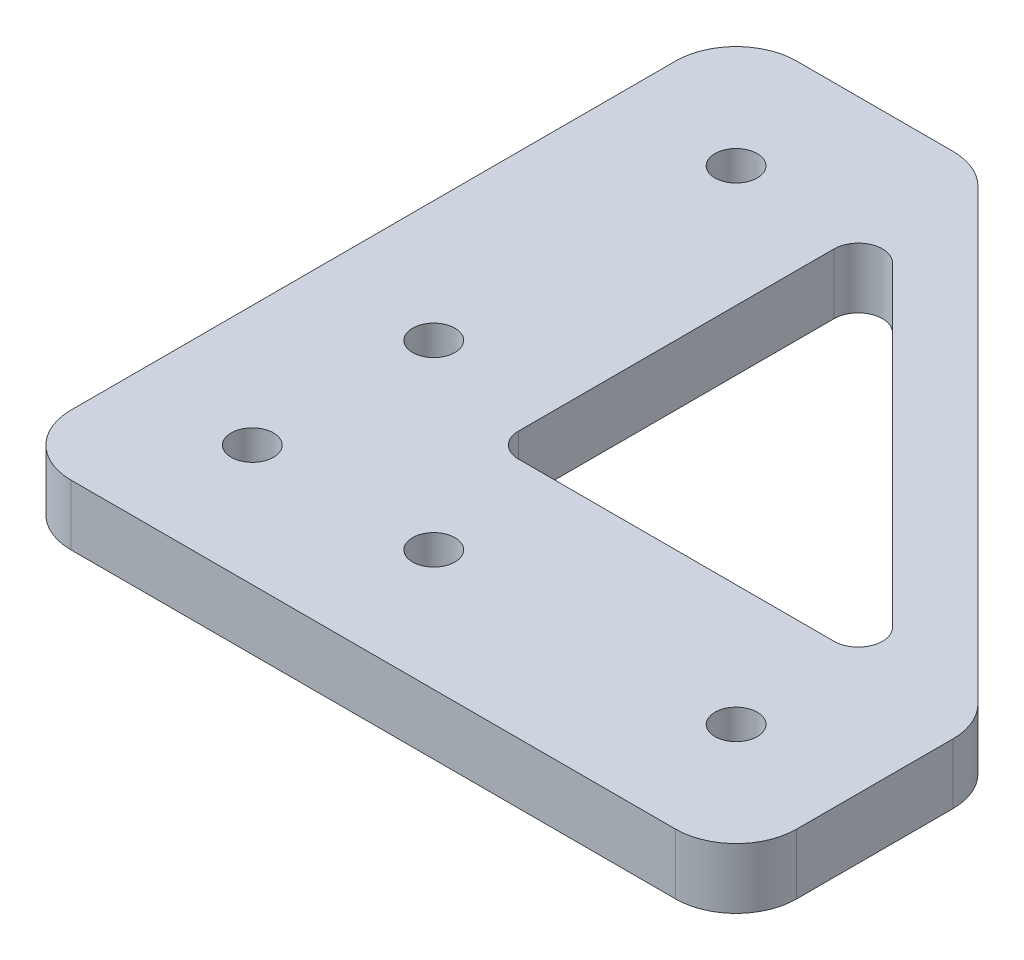
ISO-10303-21;
HEADER;
FILE_DESCRIPTION(('STEP AP214'),'2;1');
FILE_NAME('part.step','',(''),(''),'','','');
FILE_SCHEMA(('AUTOMOTIVE_DESIGN { 1 0 10303 214 1 1 1 1 }'));
ENDSEC;
DATA;
#1=APPLICATION_CONTEXT('core data for automotive mechanical design processes');
#2=APPLICATION_PROTOCOL_DEFINITION('international standard','automotive_design',2000,#1);
#3=PRODUCT_CONTEXT('',#1,'mechanical');
#4=PRODUCT('Part','Part','',(#3));
#5=PRODUCT_RELATED_PRODUCT_CATEGORY('part','',(#4));
#6=PRODUCT_DEFINITION_FORMATION('','',#4);
#7=PRODUCT_DEFINITION_CONTEXT('part definition',#1,'design');
#8=PRODUCT_DEFINITION('design','',#6,#7);
#9=PRODUCT_DEFINITION_SHAPE('','',#8);
#10=(LENGTH_UNIT() NAMED_UNIT(*) SI_UNIT(.MILLI.,.METRE.));
#11=(NAMED_UNIT(*) PLANE_ANGLE_UNIT() SI_UNIT($,.RADIAN.));
#12=(NAMED_UNIT(*) SI_UNIT($,.STERADIAN.) SOLID_ANGLE_UNIT());
#13=UNCERTAINTY_MEASURE_WITH_UNIT(LENGTH_MEASURE(1.E-05),#10,'distance_accuracy_value','');
#14=(GEOMETRIC_REPRESENTATION_CONTEXT(3) GLOBAL_UNCERTAINTY_ASSIGNED_CONTEXT((#13)) GLOBAL_UNIT_ASSIGNED_CONTEXT((#10,
#11,#12)) REPRESENTATION_CONTEXT('',''));
#15=CARTESIAN_POINT('',(0.,0.,0.));
#16=DIRECTION('',(0.,0.,1.));
#17=DIRECTION('',(1.,0.,0.));
#18=AXIS2_PLACEMENT_3D('',#15,#16,#17);
#19=CARTESIAN_POINT('',(0.,5.,-20.));
#20=DIRECTION('',(0.,0.,-1.));
#21=DIRECTION('',(-1.,0.,0.));
#22=AXIS2_PLACEMENT_3D('',#19,#20,#21);
#23=PLANE('',#22);
#24=DIRECTION('',(1.,0.,0.));
#25=VECTOR('',#24,1.);
#26=CARTESIAN_POINT('',(0.,0.,-20.));
#27=LINE('',#26,#25);
#28=CARTESIAN_POINT('',(22.,0.,-20.));
#29=VERTEX_POINT('',#28);
#30=CARTESIAN_POINT('',(48.1005050633883,0.,-20.));
#31=VERTEX_POINT('',#30);
#32=EDGE_CURVE('E157',#29,#31,#27,.T.);
#33=ORIENTED_EDGE('',*,*,#32,.F.);
#34=DIRECTION('',(0.,-1.,0.));
#35=VECTOR('',#34,1.);
#36=CARTESIAN_POINT('',(22.,5.,-20.));
#37=LINE('',#36,#35);
#38=CARTESIAN_POINT('',(22.,5.,-20.));
#39=VERTEX_POINT('',#38);
#40=EDGE_CURVE('E192',#29,#39,#37,.F.);
#41=ORIENTED_EDGE('',*,*,#40,.T.);
#42=DIRECTION('',(1.,0.,0.));
#43=VECTOR('',#42,1.);
#44=CARTESIAN_POINT('',(0.,5.,-20.));
#45=LINE('',#44,#43);
#46=CARTESIAN_POINT('',(48.1005050633883,5.,-20.));
#47=VERTEX_POINT('',#46);
#48=EDGE_CURVE('E288',#39,#47,#45,.T.);
#49=ORIENTED_EDGE('',*,*,#48,.T.);
#50=DIRECTION('',(0.,-1.,0.));
#51=VECTOR('',#50,1.);
#52=CARTESIAN_POINT('',(48.1005050633883,0.,-20.));
#53=LINE('',#52,#51);
#54=EDGE_CURVE('E190',#47,#31,#53,.T.);
#55=ORIENTED_EDGE('',*,*,#54,.T.);
#56=EDGE_LOOP('',(#33,#41,#49,#55));
#57=FACE_BOUND('',#56,.T.);
#58=ADVANCED_FACE('F37',(#57),#23,.T.);
#59=CARTESIAN_POINT('',(20.,5.,0.));
#60=DIRECTION('',(1.,0.,0.));
#61=DIRECTION('',(0.,0.,-1.));
#62=AXIS2_PLACEMENT_3D('',#59,#60,#61);
#63=PLANE('',#62);
#64=DIRECTION('',(0.,0.,1.));
#65=VECTOR('',#64,1.);
#66=CARTESIAN_POINT('',(20.,0.,0.));
#67=LINE('',#66,#65);
#68=CARTESIAN_POINT('',(20.,0.,-48.1005050633883));
#69=VERTEX_POINT('',#68);
#70=CARTESIAN_POINT('',(20.,0.,-22.));
#71=VERTEX_POINT('',#70);
#72=EDGE_CURVE('E174',#69,#71,#67,.T.);
#73=ORIENTED_EDGE('',*,*,#72,.F.);
#74=DIRECTION('',(0.,-1.,0.));
#75=VECTOR('',#74,1.);
#76=CARTESIAN_POINT('',(20.,5.,-48.1005050633883));
#77=LINE('',#76,#75);
#78=CARTESIAN_POINT('',(20.,5.,-48.1005050633883));
#79=VERTEX_POINT('',#78);
#80=EDGE_CURVE('E188',#69,#79,#77,.F.);
#81=ORIENTED_EDGE('',*,*,#80,.T.);
#82=DIRECTION('',(0.,0.,1.));
#83=VECTOR('',#82,1.);
#84=CARTESIAN_POINT('',(20.,5.,0.));
#85=LINE('',#84,#83);
#86=CARTESIAN_POINT('',(20.,5.,-22.));
#87=VERTEX_POINT('',#86);
#88=EDGE_CURVE('E182',#79,#87,#85,.T.);
#89=ORIENTED_EDGE('',*,*,#88,.T.);
#90=DIRECTION('',(0.,-1.,0.));
#91=VECTOR('',#90,1.);
#92=CARTESIAN_POINT('',(20.,0.,-22.));
#93=LINE('',#92,#91);
#94=EDGE_CURVE('E180',#87,#71,#93,.T.);
#95=ORIENTED_EDGE('',*,*,#94,.T.);
#96=EDGE_LOOP('',(#73,#81,#89,#95));
#97=FACE_BOUND('',#96,.T.);
#98=ADVANCED_FACE('F277',(#97),#63,.T.);
#99=CARTESIAN_POINT('',(60.,5.,0.));
#100=DIRECTION('',(1.,0.,0.));
#101=DIRECTION('',(0.,0.,-1.));
#102=AXIS2_PLACEMENT_3D('',#99,#100,#101);
#103=PLANE('',#102);
#104=DIRECTION('',(0.,0.,1.));
#105=VECTOR('',#104,1.);
#106=CARTESIAN_POINT('',(60.,0.,0.));
#107=LINE('',#106,#105);
#108=CARTESIAN_POINT('',(60.,0.,-17.9289321881345));
#109=VERTEX_POINT('',#108);
#110=CARTESIAN_POINT('',(60.,0.,-5.));
#111=VERTEX_POINT('',#110);
#112=EDGE_CURVE('E295',#109,#111,#107,.T.);
#113=ORIENTED_EDGE('',*,*,#112,.F.);
#114=DIRECTION('',(0.,-1.,0.));
#115=VECTOR('',#114,1.);
#116=CARTESIAN_POINT('',(60.,5.,-17.9289321881345));
#117=LINE('',#116,#115);
#118=CARTESIAN_POINT('',(60.,5.,-17.9289321881345));
#119=VERTEX_POINT('',#118);
#120=EDGE_CURVE('E220',#109,#119,#117,.F.);
#121=ORIENTED_EDGE('',*,*,#120,.T.);
#122=DIRECTION('',(0.,0.,1.));
#123=VECTOR('',#122,1.);
#124=CARTESIAN_POINT('',(60.,5.,0.));
#125=LINE('',#124,#123);
#126=CARTESIAN_POINT('',(60.,5.,-5.));
#127=VERTEX_POINT('',#126);
#128=EDGE_CURVE('E173',#119,#127,#125,.T.);
#129=ORIENTED_EDGE('',*,*,#128,.T.);
#130=DIRECTION('',(0.,-1.,0.));
#131=VECTOR('',#130,1.);
#132=CARTESIAN_POINT('',(60.,5.,-5.));
#133=LINE('',#132,#131);
#134=EDGE_CURVE('E217',#127,#111,#133,.T.);
#135=ORIENTED_EDGE('',*,*,#134,.T.);
#136=EDGE_LOOP('',(#113,#121,#129,#135));
#137=FACE_BOUND('',#136,.T.);
#138=ADVANCED_FACE('F358',(#137),#103,.T.);
#139=CARTESIAN_POINT('',(40.,5.,-40.));
#140=DIRECTION('',(0.707106781186548,0.,-0.707106781186548));
#141=DIRECTION('',(-0.707106781186548,0.,-0.707106781186548));
#142=AXIS2_PLACEMENT_3D('',#139,#140,#141);
#143=PLANE('',#142);
#144=DIRECTION('',(0.707106781186548,0.,0.707106781186548));
#145=VECTOR('',#144,1.);
#146=CARTESIAN_POINT('',(40.,5.,-40.));
#147=LINE('',#146,#145);
#148=CARTESIAN_POINT('',(21.4644660940673,5.,-58.5355339059327));
#149=VERTEX_POINT('',#148);
#150=CARTESIAN_POINT('',(58.5355339059327,5.,-21.4644660940673));
#151=VERTEX_POINT('',#150);
#152=EDGE_CURVE('E315',#149,#151,#147,.T.);
#153=ORIENTED_EDGE('',*,*,#152,.T.);
#154=DIRECTION('',(0.,-1.,0.));
#155=VECTOR('',#154,1.);
#156=CARTESIAN_POINT('',(58.5355339059327,5.,-21.4644660940673));
#157=LINE('',#156,#155);
#158=CARTESIAN_POINT('',(58.5355339059327,0.,-21.4644660940673));
#159=VERTEX_POINT('',#158);
#160=EDGE_CURVE('E204',#151,#159,#157,.T.);
#161=ORIENTED_EDGE('',*,*,#160,.T.);
#162=DIRECTION('',(0.707106781186548,0.,0.707106781186548));
#163=VECTOR('',#162,1.);
#164=CARTESIAN_POINT('',(40.,0.,-40.));
#165=LINE('',#164,#163);
#166=CARTESIAN_POINT('',(21.4644660940673,0.,-58.5355339059327));
#167=VERTEX_POINT('',#166);
#168=EDGE_CURVE('E262',#167,#159,#165,.T.);
#169=ORIENTED_EDGE('',*,*,#168,.F.);
#170=DIRECTION('',(0.,-1.,0.));
#171=VECTOR('',#170,1.);
#172=CARTESIAN_POINT('',(21.4644660940673,5.,-58.5355339059327));
#173=LINE('',#172,#171);
#174=EDGE_CURVE('E202',#167,#149,#173,.F.);
#175=ORIENTED_EDGE('',*,*,#174,.T.);
#176=EDGE_LOOP('',(#153,#161,#169,#175));
#177=FACE_BOUND('',#176,.T.);
#178=ADVANCED_FACE('F303',(#177),#143,.T.);
#179=CARTESIAN_POINT('',(0.,5.,-60.));
#180=DIRECTION('',(0.,0.,-1.));
#181=DIRECTION('',(-1.,0.,0.));
#182=AXIS2_PLACEMENT_3D('',#179,#180,#181);
#183=PLANE('',#182);
#184=DIRECTION('',(1.,0.,0.));
#185=VECTOR('',#184,1.);
#186=CARTESIAN_POINT('',(0.,5.,-60.));
#187=LINE('',#186,#185);
#188=CARTESIAN_POINT('',(5.,5.,-60.));
#189=VERTEX_POINT('',#188);
#190=CARTESIAN_POINT('',(17.9289321881345,5.,-60.));
#191=VERTEX_POINT('',#190);
#192=EDGE_CURVE('E314',#189,#191,#187,.T.);
#193=ORIENTED_EDGE('',*,*,#192,.T.);
#194=DIRECTION('',(0.,-1.,0.));
#195=VECTOR('',#194,1.);
#196=CARTESIAN_POINT('',(17.9289321881345,5.,-60.));
#197=LINE('',#196,#195);
#198=CARTESIAN_POINT('',(17.9289321881345,0.,-60.));
#199=VERTEX_POINT('',#198);
#200=EDGE_CURVE('E233',#191,#199,#197,.T.);
#201=ORIENTED_EDGE('',*,*,#200,.T.);
#202=DIRECTION('',(1.,0.,0.));
#203=VECTOR('',#202,1.);
#204=CARTESIAN_POINT('',(0.,0.,-60.));
#205=LINE('',#204,#203);
#206=CARTESIAN_POINT('',(5.,0.,-60.));
#207=VERTEX_POINT('',#206);
#208=EDGE_CURVE('E258',#207,#199,#205,.T.);
#209=ORIENTED_EDGE('',*,*,#208,.F.);
#210=DIRECTION('',(0.,-1.,0.));
#211=VECTOR('',#210,1.);
#212=CARTESIAN_POINT('',(5.,5.,-60.));
#213=LINE('',#212,#211);
#214=EDGE_CURVE('E231',#207,#189,#213,.F.);
#215=ORIENTED_EDGE('',*,*,#214,.T.);
#216=EDGE_LOOP('',(#193,#201,#209,#215));
#217=FACE_BOUND('',#216,.T.);
#218=ADVANCED_FACE('F317',(#217),#183,.T.);
#219=CARTESIAN_POINT('',(0.,5.,0.));
#220=DIRECTION('',(-1.,0.,0.));
#221=DIRECTION('',(0.,0.,1.));
#222=AXIS2_PLACEMENT_3D('',#219,#220,#221);
#223=PLANE('',#222);
#224=DIRECTION('',(0.,0.,-1.));
#225=VECTOR('',#224,1.);
#226=CARTESIAN_POINT('',(0.,5.,0.));
#227=LINE('',#226,#225);
#228=CARTESIAN_POINT('',(0.,5.,-5.));
#229=VERTEX_POINT('',#228);
#230=CARTESIAN_POINT('',(0.,5.,-55.));
#231=VERTEX_POINT('',#230);
#232=EDGE_CURVE('E248',#229,#231,#227,.T.);
#233=ORIENTED_EDGE('',*,*,#232,.T.);
#234=DIRECTION('',(0.,-1.,0.));
#235=VECTOR('',#234,1.);
#236=CARTESIAN_POINT('',(0.,5.,-55.));
#237=LINE('',#236,#235);
#238=CARTESIAN_POINT('',(0.,0.,-55.));
#239=VERTEX_POINT('',#238);
#240=EDGE_CURVE('E238',#231,#239,#237,.T.);
#241=ORIENTED_EDGE('',*,*,#240,.T.);
#242=DIRECTION('',(0.,0.,-1.));
#243=VECTOR('',#242,1.);
#244=CARTESIAN_POINT('',(0.,0.,0.));
#245=LINE('',#244,#243);
#246=CARTESIAN_POINT('',(0.,0.,-5.));
#247=VERTEX_POINT('',#246);
#248=EDGE_CURVE('E246',#247,#239,#245,.T.);
#249=ORIENTED_EDGE('',*,*,#248,.F.);
#250=DIRECTION('',(0.,-1.,0.));
#251=VECTOR('',#250,1.);
#252=CARTESIAN_POINT('',(0.,5.,-5.));
#253=LINE('',#252,#251);
#254=EDGE_CURVE('E236',#247,#229,#253,.F.);
#255=ORIENTED_EDGE('',*,*,#254,.T.);
#256=EDGE_LOOP('',(#233,#241,#249,#255));
#257=FACE_BOUND('',#256,.T.);
#258=ADVANCED_FACE('F245',(#257),#223,.T.);
#259=CARTESIAN_POINT('',(9.99999999999999,5.,-50.));
#260=DIRECTION('',(0.,-1.,0.));
#261=DIRECTION('',(0.,0.,-1.));
#262=AXIS2_PLACEMENT_3D('',#259,#260,#261);
#263=CYLINDRICAL_SURFACE('',#262,1.75);
#264=CARTESIAN_POINT('',(9.99999999999999,5.,-50.));
#265=DIRECTION('',(0.,1.,0.));
#266=DIRECTION('',(0.,0.,1.));
#267=AXIS2_PLACEMENT_3D('',#264,#265,#266);
#268=CIRCLE('',#267,1.75);
#269=CARTESIAN_POINT('',(9.99999999999999,5.,-48.25));
#270=VERTEX_POINT('',#269);
#271=EDGE_CURVE('E291',#270,#270,#268,.T.);
#272=ORIENTED_EDGE('',*,*,#271,.T.);
#273=EDGE_LOOP('',(#272));
#274=FACE_BOUND('',#273,.T.);
#275=CARTESIAN_POINT('',(9.99999999999999,0.,-50.));
#276=DIRECTION('',(0.,1.,0.));
#277=DIRECTION('',(0.,0.,1.));
#278=AXIS2_PLACEMENT_3D('',#275,#276,#277);
#279=CIRCLE('',#278,1.75);
#280=CARTESIAN_POINT('',(9.99999999999999,0.,-48.25));
#281=VERTEX_POINT('',#280);
#282=EDGE_CURVE('E271',#281,#281,#279,.T.);
#283=ORIENTED_EDGE('',*,*,#282,.F.);
#284=EDGE_LOOP('',(#283));
#285=FACE_BOUND('',#284,.T.);
#286=ADVANCED_FACE('F334',(#274,#285),#263,.F.);
#287=CARTESIAN_POINT('',(50.,5.,-10.));
#288=DIRECTION('',(0.,-1.,0.));
#289=DIRECTION('',(0.,0.,-1.));
#290=AXIS2_PLACEMENT_3D('',#287,#288,#289);
#291=CYLINDRICAL_SURFACE('',#290,1.75);
#292=CARTESIAN_POINT('',(50.,5.,-10.));
#293=DIRECTION('',(0.,1.,0.));
#294=DIRECTION('',(0.,0.,1.));
#295=AXIS2_PLACEMENT_3D('',#292,#293,#294);
#296=CIRCLE('',#295,1.75);
#297=CARTESIAN_POINT('',(50.,5.,-8.24999999999999));
#298=VERTEX_POINT('',#297);
#299=EDGE_CURVE('E329',#298,#298,#296,.T.);
#300=ORIENTED_EDGE('',*,*,#299,.T.);
#301=EDGE_LOOP('',(#300));
#302=FACE_BOUND('',#301,.T.);
#303=CARTESIAN_POINT('',(50.,0.,-10.));
#304=DIRECTION('',(0.,1.,0.));
#305=DIRECTION('',(0.,0.,1.));
#306=AXIS2_PLACEMENT_3D('',#303,#304,#305);
#307=CIRCLE('',#306,1.75);
#308=CARTESIAN_POINT('',(50.,0.,-8.24999999999999));
#309=VERTEX_POINT('',#308);
#310=EDGE_CURVE('E268',#309,#309,#307,.T.);
#311=ORIENTED_EDGE('',*,*,#310,.F.);
#312=EDGE_LOOP('',(#311));
#313=FACE_BOUND('',#312,.T.);
#314=ADVANCED_FACE('F363',(#302,#313),#291,.F.);
#315=CARTESIAN_POINT('',(10.,5.,-10.));
#316=DIRECTION('',(0.,-1.,0.));
#317=DIRECTION('',(0.,0.,-1.));
#318=AXIS2_PLACEMENT_3D('',#315,#316,#317);
#319=CYLINDRICAL_SURFACE('',#318,1.75);
#320=CARTESIAN_POINT('',(10.,5.,-10.));
#321=DIRECTION('',(0.,1.,0.));
#322=DIRECTION('',(0.,0.,1.));
#323=AXIS2_PLACEMENT_3D('',#320,#321,#322);
#324=CIRCLE('',#323,1.75);
#325=CARTESIAN_POINT('',(10.,5.,-8.25));
#326=VERTEX_POINT('',#325);
#327=EDGE_CURVE('E326',#326,#326,#324,.T.);
#328=ORIENTED_EDGE('',*,*,#327,.T.);
#329=EDGE_LOOP('',(#328));
#330=FACE_BOUND('',#329,.T.);
#331=CARTESIAN_POINT('',(10.,0.,-10.));
#332=DIRECTION('',(0.,1.,0.));
#333=DIRECTION('',(0.,0.,1.));
#334=AXIS2_PLACEMENT_3D('',#331,#332,#333);
#335=CIRCLE('',#334,1.75);
#336=CARTESIAN_POINT('',(10.,0.,-8.25));
#337=VERTEX_POINT('',#336);
#338=EDGE_CURVE('E260',#337,#337,#335,.T.);
#339=ORIENTED_EDGE('',*,*,#338,.F.);
#340=EDGE_LOOP('',(#339));
#341=FACE_BOUND('',#340,.T.);
#342=ADVANCED_FACE('F366',(#330,#341),#319,.F.);
#343=CARTESIAN_POINT('',(0.,5.,0.));
#344=DIRECTION('',(0.,0.,1.));
#345=DIRECTION('',(1.,0.,0.));
#346=AXIS2_PLACEMENT_3D('',#343,#344,#345);
#347=PLANE('',#346);
#348=DIRECTION('',(-1.,0.,0.));
#349=VECTOR('',#348,1.);
#350=CARTESIAN_POINT('',(0.,5.,0.));
#351=LINE('',#350,#349);
#352=CARTESIAN_POINT('',(55.,5.,0.));
#353=VERTEX_POINT('',#352);
#354=CARTESIAN_POINT('',(5.,5.,0.));
#355=VERTEX_POINT('',#354);
#356=EDGE_CURVE('E320',#353,#355,#351,.T.);
#357=ORIENTED_EDGE('',*,*,#356,.T.);
#358=DIRECTION('',(0.,-1.,0.));
#359=VECTOR('',#358,1.);
#360=CARTESIAN_POINT('',(5.,5.,0.));
#361=LINE('',#360,#359);
#362=CARTESIAN_POINT('',(5.,0.,0.));
#363=VERTEX_POINT('',#362);
#364=EDGE_CURVE('E11',#355,#363,#361,.T.);
#365=ORIENTED_EDGE('',*,*,#364,.T.);
#366=DIRECTION('',(-1.,0.,0.));
#367=VECTOR('',#366,1.);
#368=CARTESIAN_POINT('',(0.,0.,0.));
#369=LINE('',#368,#367);
#370=CARTESIAN_POINT('',(55.,0.,0.));
#371=VERTEX_POINT('',#370);
#372=EDGE_CURVE('E257',#371,#363,#369,.T.);
#373=ORIENTED_EDGE('',*,*,#372,.F.);
#374=DIRECTION('',(0.,-1.,0.));
#375=VECTOR('',#374,1.);
#376=CARTESIAN_POINT('',(55.,5.,0.));
#377=LINE('',#376,#375);
#378=EDGE_CURVE('E45',#371,#353,#377,.F.);
#379=ORIENTED_EDGE('',*,*,#378,.T.);
#380=EDGE_LOOP('',(#357,#365,#373,#379));
#381=FACE_BOUND('',#380,.T.);
#382=ADVANCED_FACE('F347',(#381),#347,.T.);
#383=CARTESIAN_POINT('',(36.4644660940672,5.,-36.4644660940673));
#384=DIRECTION('',(-0.707106781186547,0.,0.707106781186548));
#385=DIRECTION('',(0.707106781186548,0.,0.707106781186547));
#386=AXIS2_PLACEMENT_3D('',#383,#384,#385);
#387=PLANE('',#386);
#388=DIRECTION('',(-0.707106781186548,0.,-0.707106781186547));
#389=VECTOR('',#388,1.);
#390=CARTESIAN_POINT('',(36.4644660940672,5.,-36.4644660940673));
#391=LINE('',#390,#389);
#392=CARTESIAN_POINT('',(49.5147186257614,5.,-23.4142135623731));
#393=VERTEX_POINT('',#392);
#394=CARTESIAN_POINT('',(23.4142135623731,5.,-49.5147186257614));
#395=VERTEX_POINT('',#394);
#396=EDGE_CURVE('E178',#393,#395,#391,.T.);
#397=ORIENTED_EDGE('',*,*,#396,.T.);
#398=DIRECTION('',(0.,-1.,0.));
#399=VECTOR('',#398,1.);
#400=CARTESIAN_POINT('',(23.4142135623731,0.,-49.5147186257614));
#401=LINE('',#400,#399);
#402=CARTESIAN_POINT('',(23.4142135623731,0.,-49.5147186257614));
#403=VERTEX_POINT('',#402);
#404=EDGE_CURVE('E172',#395,#403,#401,.T.);
#405=ORIENTED_EDGE('',*,*,#404,.T.);
#406=DIRECTION('',(-0.707106781186548,0.,-0.707106781186547));
#407=VECTOR('',#406,1.);
#408=CARTESIAN_POINT('',(36.4644660940672,0.,-36.4644660940673));
#409=LINE('',#408,#407);
#410=CARTESIAN_POINT('',(49.5147186257614,0.,-23.4142135623731));
#411=VERTEX_POINT('',#410);
#412=EDGE_CURVE('E155',#411,#403,#409,.T.);
#413=ORIENTED_EDGE('',*,*,#412,.F.);
#414=DIRECTION('',(0.,-1.,0.));
#415=VECTOR('',#414,1.);
#416=CARTESIAN_POINT('',(49.5147186257614,5.,-23.4142135623731));
#417=LINE('',#416,#415);
#418=EDGE_CURVE('E169',#411,#393,#417,.F.);
#419=ORIENTED_EDGE('',*,*,#418,.T.);
#420=EDGE_LOOP('',(#397,#405,#413,#419));
#421=FACE_BOUND('',#420,.T.);
#422=ADVANCED_FACE('F168',(#421),#387,.T.);
#423=CARTESIAN_POINT('',(0.,5.,0.));
#424=DIRECTION('',(0.,1.,0.));
#425=DIRECTION('',(0.,0.,1.));
#426=AXIS2_PLACEMENT_3D('',#423,#424,#425);
#427=PLANE('',#426);
#428=CARTESIAN_POINT('',(10.,5.,-25.));
#429=DIRECTION('',(0.,1.,0.));
#430=DIRECTION('',(0.,0.,1.));
#431=AXIS2_PLACEMENT_3D('',#428,#429,#430);
#432=CIRCLE('',#431,1.75);
#433=CARTESIAN_POINT('',(10.,5.,-23.25));
#434=VERTEX_POINT('',#433);
#435=EDGE_CURVE('E297',#434,#434,#432,.T.);
#436=ORIENTED_EDGE('',*,*,#435,.F.);
#437=EDGE_LOOP('',(#436));
#438=FACE_BOUND('',#437,.T.);
#439=CARTESIAN_POINT('',(25.,5.,-10.));
#440=DIRECTION('',(0.,1.,0.));
#441=DIRECTION('',(0.,0.,1.));
#442=AXIS2_PLACEMENT_3D('',#439,#440,#441);
#443=CIRCLE('',#442,1.75);
#444=CARTESIAN_POINT('',(25.,5.,-8.25));
#445=VERTEX_POINT('',#444);
#446=EDGE_CURVE('E415',#445,#445,#443,.T.);
#447=ORIENTED_EDGE('',*,*,#446,.F.);
#448=EDGE_LOOP('',(#447));
#449=FACE_BOUND('',#448,.T.);
#450=ORIENTED_EDGE('',*,*,#128,.F.);
#451=CARTESIAN_POINT('',(55.,5.,-17.9289321881345));
#452=DIRECTION('',(0.,1.,0.));
#453=DIRECTION('',(0.,0.,1.));
#454=AXIS2_PLACEMENT_3D('',#451,#452,#453);
#455=CIRCLE('',#454,5.);
#456=EDGE_CURVE('E229',#119,#151,#455,.T.);
#457=ORIENTED_EDGE('',*,*,#456,.T.);
#458=ORIENTED_EDGE('',*,*,#152,.F.);
#459=CARTESIAN_POINT('',(17.9289321881345,5.,-55.));
#460=DIRECTION('',(0.,1.,0.));
#461=DIRECTION('',(0.,0.,1.));
#462=AXIS2_PLACEMENT_3D('',#459,#460,#461);
#463=CIRCLE('',#462,5.);
#464=EDGE_CURVE('E227',#149,#191,#463,.T.);
#465=ORIENTED_EDGE('',*,*,#464,.T.);
#466=ORIENTED_EDGE('',*,*,#192,.F.);
#467=CARTESIAN_POINT('',(5.,5.,-55.));
#468=DIRECTION('',(0.,1.,0.));
#469=DIRECTION('',(0.,0.,1.));
#470=AXIS2_PLACEMENT_3D('',#467,#468,#469);
#471=CIRCLE('',#470,5.);
#472=EDGE_CURVE('E225',#189,#231,#471,.T.);
#473=ORIENTED_EDGE('',*,*,#472,.T.);
#474=ORIENTED_EDGE('',*,*,#232,.F.);
#475=CARTESIAN_POINT('',(5.,5.,-5.));
#476=DIRECTION('',(0.,1.,0.));
#477=DIRECTION('',(0.,0.,1.));
#478=AXIS2_PLACEMENT_3D('',#475,#476,#477);
#479=CIRCLE('',#478,5.);
#480=EDGE_CURVE('E52',#229,#355,#479,.T.);
#481=ORIENTED_EDGE('',*,*,#480,.T.);
#482=ORIENTED_EDGE('',*,*,#356,.F.);
#483=CARTESIAN_POINT('',(55.,5.,-5.));
#484=DIRECTION('',(0.,1.,0.));
#485=DIRECTION('',(0.,0.,1.));
#486=AXIS2_PLACEMENT_3D('',#483,#484,#485);
#487=CIRCLE('',#486,5.);
#488=EDGE_CURVE('E222',#353,#127,#487,.T.);
#489=ORIENTED_EDGE('',*,*,#488,.T.);
#490=EDGE_LOOP('',(#450,#457,#458,#465,#466,#473,#474,#481,#482,#489));
#491=FACE_BOUND('',#490,.T.);
#492=ORIENTED_EDGE('',*,*,#327,.F.);
#493=EDGE_LOOP('',(#492));
#494=FACE_BOUND('',#493,.T.);
#495=ORIENTED_EDGE('',*,*,#299,.F.);
#496=EDGE_LOOP('',(#495));
#497=FACE_BOUND('',#496,.T.);
#498=ORIENTED_EDGE('',*,*,#271,.F.);
#499=EDGE_LOOP('',(#498));
#500=FACE_BOUND('',#499,.T.);
#501=ORIENTED_EDGE('',*,*,#48,.F.);
#502=CARTESIAN_POINT('',(22.,5.,-22.));
#503=DIRECTION('',(0.,1.,0.));
#504=DIRECTION('',(0.,0.,1.));
#505=AXIS2_PLACEMENT_3D('',#502,#503,#504);
#506=CIRCLE('',#505,2.);
#507=EDGE_CURVE('E163',#39,#87,#506,.F.);
#508=ORIENTED_EDGE('',*,*,#507,.T.);
#509=ORIENTED_EDGE('',*,*,#88,.F.);
#510=CARTESIAN_POINT('',(22.,5.,-48.1005050633883));
#511=DIRECTION('',(0.,1.,0.));
#512=DIRECTION('',(0.,0.,1.));
#513=AXIS2_PLACEMENT_3D('',#510,#511,#512);
#514=CIRCLE('',#513,2.);
#515=EDGE_CURVE('E196',#79,#395,#514,.F.);
#516=ORIENTED_EDGE('',*,*,#515,.T.);
#517=ORIENTED_EDGE('',*,*,#396,.F.);
#518=CARTESIAN_POINT('',(48.1005050633883,5.,-22.));
#519=DIRECTION('',(0.,1.,0.));
#520=DIRECTION('',(0.,0.,1.));
#521=AXIS2_PLACEMENT_3D('',#518,#519,#520);
#522=CIRCLE('',#521,2.);
#523=EDGE_CURVE('E162',#393,#47,#522,.F.);
#524=ORIENTED_EDGE('',*,*,#523,.T.);
#525=EDGE_LOOP('',(#501,#508,#509,#516,#517,#524));
#526=FACE_BOUND('',#525,.T.);
#527=ADVANCED_FACE('F286',(#438,#449,#491,#494,#497,#500,#526),#427,.T.);
#528=CARTESIAN_POINT('',(0.,0.,0.));
#529=DIRECTION('',(0.,1.,0.));
#530=DIRECTION('',(0.,0.,1.));
#531=AXIS2_PLACEMENT_3D('',#528,#529,#530);
#532=PLANE('',#531);
#533=CARTESIAN_POINT('',(10.,0.,-25.));
#534=DIRECTION('',(0.,-1.,0.));
#535=DIRECTION('',(0.,0.,-1.));
#536=AXIS2_PLACEMENT_3D('',#533,#534,#535);
#537=CIRCLE('',#536,1.75);
#538=CARTESIAN_POINT('',(10.,0.,-26.75));
#539=VERTEX_POINT('',#538);
#540=EDGE_CURVE('E418',#539,#539,#537,.T.);
#541=ORIENTED_EDGE('',*,*,#540,.F.);
#542=EDGE_LOOP('',(#541));
#543=FACE_BOUND('',#542,.T.);
#544=CARTESIAN_POINT('',(25.,0.,-10.));
#545=DIRECTION('',(0.,-1.,0.));
#546=DIRECTION('',(0.,0.,-1.));
#547=AXIS2_PLACEMENT_3D('',#544,#545,#546);
#548=CIRCLE('',#547,1.75);
#549=CARTESIAN_POINT('',(25.,0.,-11.75));
#550=VERTEX_POINT('',#549);
#551=EDGE_CURVE('E419',#550,#550,#548,.T.);
#552=ORIENTED_EDGE('',*,*,#551,.F.);
#553=EDGE_LOOP('',(#552));
#554=FACE_BOUND('',#553,.T.);
#555=ORIENTED_EDGE('',*,*,#168,.T.);
#556=CARTESIAN_POINT('',(55.,0.,-17.9289321881345));
#557=DIRECTION('',(0.,1.,0.));
#558=DIRECTION('',(0.,0.,1.));
#559=AXIS2_PLACEMENT_3D('',#556,#557,#558);
#560=CIRCLE('',#559,5.);
#561=EDGE_CURVE('E215',#159,#109,#560,.F.);
#562=ORIENTED_EDGE('',*,*,#561,.T.);
#563=ORIENTED_EDGE('',*,*,#112,.T.);
#564=CARTESIAN_POINT('',(55.,0.,-5.));
#565=DIRECTION('',(0.,1.,0.));
#566=DIRECTION('',(0.,0.,1.));
#567=AXIS2_PLACEMENT_3D('',#564,#565,#566);
#568=CIRCLE('',#567,5.);
#569=EDGE_CURVE('E207',#111,#371,#568,.F.);
#570=ORIENTED_EDGE('',*,*,#569,.T.);
#571=ORIENTED_EDGE('',*,*,#372,.T.);
#572=CARTESIAN_POINT('',(5.,0.,-5.));
#573=DIRECTION('',(0.,1.,0.));
#574=DIRECTION('',(0.,0.,1.));
#575=AXIS2_PLACEMENT_3D('',#572,#573,#574);
#576=CIRCLE('',#575,5.);
#577=EDGE_CURVE('E209',#363,#247,#576,.F.);
#578=ORIENTED_EDGE('',*,*,#577,.T.);
#579=ORIENTED_EDGE('',*,*,#248,.T.);
#580=CARTESIAN_POINT('',(5.,0.,-55.));
#581=DIRECTION('',(0.,1.,0.));
#582=DIRECTION('',(0.,0.,1.));
#583=AXIS2_PLACEMENT_3D('',#580,#581,#582);
#584=CIRCLE('',#583,5.);
#585=EDGE_CURVE('E211',#239,#207,#584,.F.);
#586=ORIENTED_EDGE('',*,*,#585,.T.);
#587=ORIENTED_EDGE('',*,*,#208,.T.);
#588=CARTESIAN_POINT('',(17.9289321881345,0.,-55.));
#589=DIRECTION('',(0.,1.,0.));
#590=DIRECTION('',(0.,0.,1.));
#591=AXIS2_PLACEMENT_3D('',#588,#589,#590);
#592=CIRCLE('',#591,5.);
#593=EDGE_CURVE('E213',#199,#167,#592,.F.);
#594=ORIENTED_EDGE('',*,*,#593,.T.);
#595=EDGE_LOOP('',(#555,#562,#563,#570,#571,#578,#579,#586,#587,#594));
#596=FACE_BOUND('',#595,.T.);
#597=ORIENTED_EDGE('',*,*,#338,.T.);
#598=EDGE_LOOP('',(#597));
#599=FACE_BOUND('',#598,.T.);
#600=ORIENTED_EDGE('',*,*,#310,.T.);
#601=EDGE_LOOP('',(#600));
#602=FACE_BOUND('',#601,.T.);
#603=ORIENTED_EDGE('',*,*,#282,.T.);
#604=EDGE_LOOP('',(#603));
#605=FACE_BOUND('',#604,.T.);
#606=ORIENTED_EDGE('',*,*,#72,.T.);
#607=CARTESIAN_POINT('',(22.,0.,-22.));
#608=DIRECTION('',(0.,1.,0.));
#609=DIRECTION('',(0.,0.,1.));
#610=AXIS2_PLACEMENT_3D('',#607,#608,#609);
#611=CIRCLE('',#610,2.);
#612=EDGE_CURVE('E198',#71,#29,#611,.T.);
#613=ORIENTED_EDGE('',*,*,#612,.T.);
#614=ORIENTED_EDGE('',*,*,#32,.T.);
#615=CARTESIAN_POINT('',(48.1005050633883,0.,-22.));
#616=DIRECTION('',(0.,1.,0.));
#617=DIRECTION('',(0.,0.,1.));
#618=AXIS2_PLACEMENT_3D('',#615,#616,#617);
#619=CIRCLE('',#618,2.);
#620=EDGE_CURVE('E151',#31,#411,#619,.T.);
#621=ORIENTED_EDGE('',*,*,#620,.T.);
#622=ORIENTED_EDGE('',*,*,#412,.T.);
#623=CARTESIAN_POINT('',(22.,0.,-48.1005050633883));
#624=DIRECTION('',(0.,1.,0.));
#625=DIRECTION('',(0.,0.,1.));
#626=AXIS2_PLACEMENT_3D('',#623,#624,#625);
#627=CIRCLE('',#626,2.);
#628=EDGE_CURVE('E194',#403,#69,#627,.T.);
#629=ORIENTED_EDGE('',*,*,#628,.T.);
#630=EDGE_LOOP('',(#606,#613,#614,#621,#622,#629));
#631=FACE_BOUND('',#630,.T.);
#632=ADVANCED_FACE('F154',(#543,#554,#596,#599,#602,#605,#631),#532,.F.);
#633=CARTESIAN_POINT('',(22.,5.,-48.1005050633883));
#634=DIRECTION('',(0.,1.,0.));
#635=DIRECTION('',(0.,0.,1.));
#636=AXIS2_PLACEMENT_3D('',#633,#634,#635);
#637=CYLINDRICAL_SURFACE('',#636,2.);
#638=ORIENTED_EDGE('',*,*,#515,.F.);
#639=ORIENTED_EDGE('',*,*,#80,.F.);
#640=ORIENTED_EDGE('',*,*,#628,.F.);
#641=ORIENTED_EDGE('',*,*,#404,.F.);
#642=EDGE_LOOP('',(#638,#639,#640,#641));
#643=FACE_BOUND('',#642,.T.);
#644=ADVANCED_FACE('F283',(#643),#637,.F.);
#645=CARTESIAN_POINT('',(22.,5.,-22.));
#646=DIRECTION('',(0.,1.,0.));
#647=DIRECTION('',(0.,0.,1.));
#648=AXIS2_PLACEMENT_3D('',#645,#646,#647);
#649=CYLINDRICAL_SURFACE('',#648,2.);
#650=ORIENTED_EDGE('',*,*,#507,.F.);
#651=ORIENTED_EDGE('',*,*,#40,.F.);
#652=ORIENTED_EDGE('',*,*,#612,.F.);
#653=ORIENTED_EDGE('',*,*,#94,.F.);
#654=EDGE_LOOP('',(#650,#651,#652,#653));
#655=FACE_BOUND('',#654,.T.);
#656=ADVANCED_FACE('F383',(#655),#649,.F.);
#657=CARTESIAN_POINT('',(48.1005050633883,5.,-22.));
#658=DIRECTION('',(0.,1.,0.));
#659=DIRECTION('',(0.,0.,1.));
#660=AXIS2_PLACEMENT_3D('',#657,#658,#659);
#661=CYLINDRICAL_SURFACE('',#660,2.);
#662=ORIENTED_EDGE('',*,*,#523,.F.);
#663=ORIENTED_EDGE('',*,*,#418,.F.);
#664=ORIENTED_EDGE('',*,*,#620,.F.);
#665=ORIENTED_EDGE('',*,*,#54,.F.);
#666=EDGE_LOOP('',(#662,#663,#664,#665));
#667=FACE_BOUND('',#666,.T.);
#668=ADVANCED_FACE('F177',(#667),#661,.F.);
#669=CARTESIAN_POINT('',(25.,10.,-10.));
#670=DIRECTION('',(0.,-1.,0.));
#671=DIRECTION('',(0.,0.,-1.));
#672=AXIS2_PLACEMENT_3D('',#669,#670,#671);
#673=CYLINDRICAL_SURFACE('',#672,1.75);
#674=ORIENTED_EDGE('',*,*,#446,.T.);
#675=EDGE_LOOP('',(#674));
#676=FACE_BOUND('',#675,.T.);
#677=ORIENTED_EDGE('',*,*,#551,.T.);
#678=EDGE_LOOP('',(#677));
#679=FACE_BOUND('',#678,.T.);
#680=ADVANCED_FACE('F389',(#676,#679),#673,.F.);
#681=CARTESIAN_POINT('',(10.,10.,-25.));
#682=DIRECTION('',(0.,-1.,0.));
#683=DIRECTION('',(0.,0.,-1.));
#684=AXIS2_PLACEMENT_3D('',#681,#682,#683);
#685=CYLINDRICAL_SURFACE('',#684,1.75);
#686=ORIENTED_EDGE('',*,*,#435,.T.);
#687=EDGE_LOOP('',(#686));
#688=FACE_BOUND('',#687,.T.);
#689=ORIENTED_EDGE('',*,*,#540,.T.);
#690=EDGE_LOOP('',(#689));
#691=FACE_BOUND('',#690,.T.);
#692=ADVANCED_FACE('F393',(#688,#691),#685,.F.);
#693=CARTESIAN_POINT('',(55.,5.,-17.9289321881345));
#694=DIRECTION('',(0.,-1.,0.));
#695=DIRECTION('',(0.,0.,-1.));
#696=AXIS2_PLACEMENT_3D('',#693,#694,#695);
#697=CYLINDRICAL_SURFACE('',#696,5.);
#698=ORIENTED_EDGE('',*,*,#456,.F.);
#699=ORIENTED_EDGE('',*,*,#120,.F.);
#700=ORIENTED_EDGE('',*,*,#561,.F.);
#701=ORIENTED_EDGE('',*,*,#160,.F.);
#702=EDGE_LOOP('',(#698,#699,#700,#701));
#703=FACE_BOUND('',#702,.T.);
#704=ADVANCED_FACE('F390',(#703),#697,.T.);
#705=CARTESIAN_POINT('',(17.9289321881345,5.,-55.));
#706=DIRECTION('',(0.,-1.,0.));
#707=DIRECTION('',(0.,0.,-1.));
#708=AXIS2_PLACEMENT_3D('',#705,#706,#707);
#709=CYLINDRICAL_SURFACE('',#708,5.);
#710=ORIENTED_EDGE('',*,*,#464,.F.);
#711=ORIENTED_EDGE('',*,*,#174,.F.);
#712=ORIENTED_EDGE('',*,*,#593,.F.);
#713=ORIENTED_EDGE('',*,*,#200,.F.);
#714=EDGE_LOOP('',(#710,#711,#712,#713));
#715=FACE_BOUND('',#714,.T.);
#716=ADVANCED_FACE('F308',(#715),#709,.T.);
#717=CARTESIAN_POINT('',(5.,5.,-55.));
#718=DIRECTION('',(0.,-1.,0.));
#719=DIRECTION('',(0.,0.,-1.));
#720=AXIS2_PLACEMENT_3D('',#717,#718,#719);
#721=CYLINDRICAL_SURFACE('',#720,5.);
#722=ORIENTED_EDGE('',*,*,#472,.F.);
#723=ORIENTED_EDGE('',*,*,#214,.F.);
#724=ORIENTED_EDGE('',*,*,#585,.F.);
#725=ORIENTED_EDGE('',*,*,#240,.F.);
#726=EDGE_LOOP('',(#722,#723,#724,#725));
#727=FACE_BOUND('',#726,.T.);
#728=ADVANCED_FACE('F397',(#727),#721,.T.);
#729=CARTESIAN_POINT('',(5.,5.,-5.));
#730=DIRECTION('',(0.,-1.,0.));
#731=DIRECTION('',(0.,0.,-1.));
#732=AXIS2_PLACEMENT_3D('',#729,#730,#731);
#733=CYLINDRICAL_SURFACE('',#732,5.);
#734=ORIENTED_EDGE('',*,*,#480,.F.);
#735=ORIENTED_EDGE('',*,*,#254,.F.);
#736=ORIENTED_EDGE('',*,*,#577,.F.);
#737=ORIENTED_EDGE('',*,*,#364,.F.);
#738=EDGE_LOOP('',(#734,#735,#736,#737));
#739=FACE_BOUND('',#738,.T.);
#740=ADVANCED_FACE('F399',(#739),#733,.T.);
#741=CARTESIAN_POINT('',(55.,5.,-5.));
#742=DIRECTION('',(0.,-1.,0.));
#743=DIRECTION('',(0.,0.,-1.));
#744=AXIS2_PLACEMENT_3D('',#741,#742,#743);
#745=CYLINDRICAL_SURFACE('',#744,5.);
#746=ORIENTED_EDGE('',*,*,#488,.F.);
#747=ORIENTED_EDGE('',*,*,#378,.F.);
#748=ORIENTED_EDGE('',*,*,#569,.F.);
#749=ORIENTED_EDGE('',*,*,#134,.F.);
#750=EDGE_LOOP('',(#746,#747,#748,#749));
#751=FACE_BOUND('',#750,.T.);
#752=ADVANCED_FACE('F39',(#751),#745,.T.);
#753=CLOSED_SHELL('',(#58,#98,#138,#178,#218,#258,#286,#314,#342,#382,#422,#527,#632,#644,#656,
#668,#680,#692,#704,#716,#728,#740,#752));
#754=MANIFOLD_SOLID_BREP('B2',#753);
#755=ADVANCED_BREP_SHAPE_REPRESENTATION('',(#18,#754),#14);
#756=SHAPE_DEFINITION_REPRESENTATION(#9,#755);
ENDSEC;
END-ISO-10303-21;
